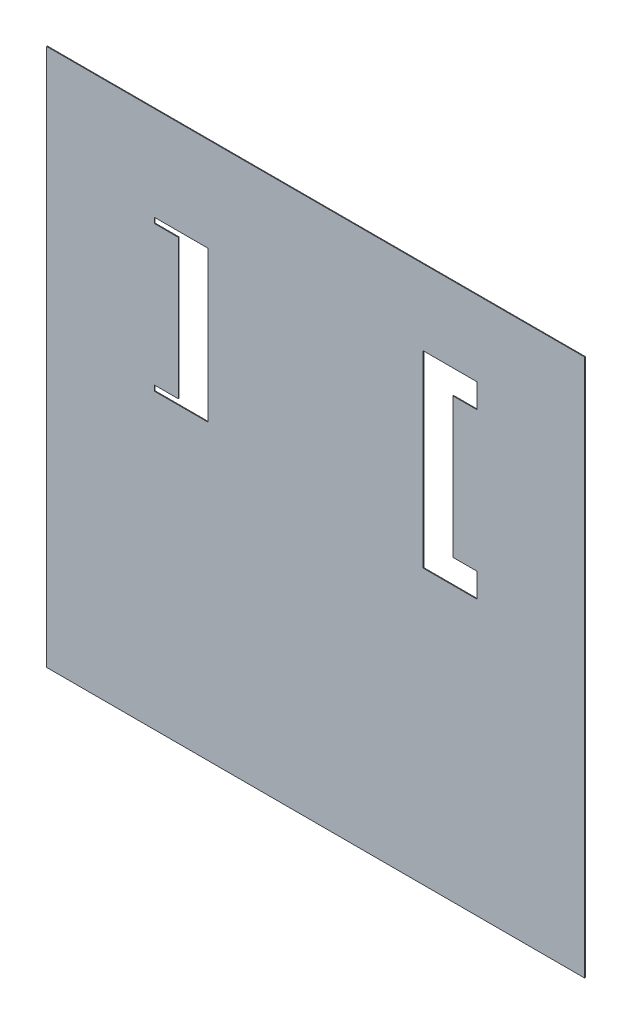
ISO-10303-21;
HEADER;
FILE_DESCRIPTION(('STEP AP214'),'2;1');
FILE_NAME('part.step','',(''),(''),'','','');
FILE_SCHEMA(('AUTOMOTIVE_DESIGN { 1 0 10303 214 1 1 1 1 }'));
ENDSEC;
DATA;
#1=APPLICATION_CONTEXT('core data for automotive mechanical design processes');
#2=APPLICATION_PROTOCOL_DEFINITION('international standard','automotive_design',2000,#1);
#3=PRODUCT_CONTEXT('',#1,'mechanical');
#4=PRODUCT('Part','Part','',(#3));
#5=PRODUCT_RELATED_PRODUCT_CATEGORY('part','',(#4));
#6=PRODUCT_DEFINITION_FORMATION('','',#4);
#7=PRODUCT_DEFINITION_CONTEXT('part definition',#1,'design');
#8=PRODUCT_DEFINITION('design','',#6,#7);
#9=PRODUCT_DEFINITION_SHAPE('','',#8);
#10=(LENGTH_UNIT() NAMED_UNIT(*) SI_UNIT(.MILLI.,.METRE.));
#11=(NAMED_UNIT(*) PLANE_ANGLE_UNIT() SI_UNIT($,.RADIAN.));
#12=(NAMED_UNIT(*) SI_UNIT($,.STERADIAN.) SOLID_ANGLE_UNIT());
#13=UNCERTAINTY_MEASURE_WITH_UNIT(LENGTH_MEASURE(1.E-05),#10,'distance_accuracy_value','');
#14=(GEOMETRIC_REPRESENTATION_CONTEXT(3) GLOBAL_UNCERTAINTY_ASSIGNED_CONTEXT((#13)) GLOBAL_UNIT_ASSIGNED_CONTEXT((#10,
#11,#12)) REPRESENTATION_CONTEXT('',''));
#15=CARTESIAN_POINT('',(0.,0.,0.));
#16=DIRECTION('',(0.,0.,1.));
#17=DIRECTION('',(1.,0.,0.));
#18=AXIS2_PLACEMENT_3D('',#15,#16,#17);
#19=CARTESIAN_POINT('',(0.,0.,0.03556));
#20=DIRECTION('',(1.,0.,0.));
#21=DIRECTION('',(0.,0.,-1.));
#22=AXIS2_PLACEMENT_3D('',#19,#20,#21);
#23=PLANE('',#22);
#24=DIRECTION('',(0.,-1.,0.));
#25=VECTOR('',#24,1.);
#26=CARTESIAN_POINT('',(0.,0.,0.));
#27=LINE('',#26,#25);
#28=CARTESIAN_POINT('',(0.,25.4,0.));
#29=VERTEX_POINT('',#28);
#30=CARTESIAN_POINT('',(0.,0.,0.));
#31=VERTEX_POINT('',#30);
#32=EDGE_CURVE('E287',#29,#31,#27,.T.);
#33=ORIENTED_EDGE('',*,*,#32,.T.);
#34=DIRECTION('',(0.,0.,-1.));
#35=VECTOR('',#34,1.);
#36=CARTESIAN_POINT('',(0.,0.,0.03556));
#37=LINE('',#36,#35);
#38=CARTESIAN_POINT('',(0.,0.,0.03556));
#39=VERTEX_POINT('',#38);
#40=EDGE_CURVE('E11',#39,#31,#37,.T.);
#41=ORIENTED_EDGE('',*,*,#40,.F.);
#42=DIRECTION('',(0.,-1.,0.));
#43=VECTOR('',#42,1.);
#44=CARTESIAN_POINT('',(0.,0.,0.03556));
#45=LINE('',#44,#43);
#46=CARTESIAN_POINT('',(0.,25.4,0.03556));
#47=VERTEX_POINT('',#46);
#48=EDGE_CURVE('E302',#47,#39,#45,.T.);
#49=ORIENTED_EDGE('',*,*,#48,.F.);
#50=DIRECTION('',(0.,0.,-1.));
#51=VECTOR('',#50,1.);
#52=CARTESIAN_POINT('',(0.,25.4,0.03556));
#53=LINE('',#52,#51);
#54=EDGE_CURVE('E312',#47,#29,#53,.T.);
#55=ORIENTED_EDGE('',*,*,#54,.T.);
#56=EDGE_LOOP('',(#33,#41,#49,#55));
#57=FACE_BOUND('',#56,.T.);
#58=ADVANCED_FACE('F33',(#57),#23,.F.);
#59=CARTESIAN_POINT('',(0.,0.,0.03556));
#60=DIRECTION('',(0.,1.,0.));
#61=DIRECTION('',(0.,0.,1.));
#62=AXIS2_PLACEMENT_3D('',#59,#60,#61);
#63=PLANE('',#62);
#64=DIRECTION('',(1.,0.,0.));
#65=VECTOR('',#64,1.);
#66=CARTESIAN_POINT('',(0.,0.,0.));
#67=LINE('',#66,#65);
#68=CARTESIAN_POINT('',(25.4,0.,0.));
#69=VERTEX_POINT('',#68);
#70=EDGE_CURVE('E315',#31,#69,#67,.T.);
#71=ORIENTED_EDGE('',*,*,#70,.T.);
#72=DIRECTION('',(0.,0.,-1.));
#73=VECTOR('',#72,1.);
#74=CARTESIAN_POINT('',(25.4,0.,0.03556));
#75=LINE('',#74,#73);
#76=CARTESIAN_POINT('',(25.4,0.,0.03556));
#77=VERTEX_POINT('',#76);
#78=EDGE_CURVE('E40',#77,#69,#75,.T.);
#79=ORIENTED_EDGE('',*,*,#78,.F.);
#80=DIRECTION('',(1.,0.,0.));
#81=VECTOR('',#80,1.);
#82=CARTESIAN_POINT('',(0.,0.,0.03556));
#83=LINE('',#82,#81);
#84=EDGE_CURVE('E305',#39,#77,#83,.T.);
#85=ORIENTED_EDGE('',*,*,#84,.F.);
#86=ORIENTED_EDGE('',*,*,#40,.T.);
#87=EDGE_LOOP('',(#71,#79,#85,#86));
#88=FACE_BOUND('',#87,.T.);
#89=ADVANCED_FACE('F344',(#88),#63,.F.);
#90=CARTESIAN_POINT('',(25.4,0.,0.03556));
#91=DIRECTION('',(-1.,0.,0.));
#92=DIRECTION('',(0.,0.,1.));
#93=AXIS2_PLACEMENT_3D('',#90,#91,#92);
#94=PLANE('',#93);
#95=DIRECTION('',(0.,1.,0.));
#96=VECTOR('',#95,1.);
#97=CARTESIAN_POINT('',(25.4,0.,0.));
#98=LINE('',#97,#96);
#99=CARTESIAN_POINT('',(25.4,25.4,0.));
#100=VERTEX_POINT('',#99);
#101=EDGE_CURVE('E317',#69,#100,#98,.T.);
#102=ORIENTED_EDGE('',*,*,#101,.T.);
#103=DIRECTION('',(0.,0.,-1.));
#104=VECTOR('',#103,1.);
#105=CARTESIAN_POINT('',(25.4,25.4,0.03556));
#106=LINE('',#105,#104);
#107=CARTESIAN_POINT('',(25.4,25.4,0.03556));
#108=VERTEX_POINT('',#107);
#109=EDGE_CURVE('E322',#108,#100,#106,.T.);
#110=ORIENTED_EDGE('',*,*,#109,.F.);
#111=DIRECTION('',(0.,1.,0.));
#112=VECTOR('',#111,1.);
#113=CARTESIAN_POINT('',(25.4,0.,0.03556));
#114=LINE('',#113,#112);
#115=EDGE_CURVE('E308',#77,#108,#114,.T.);
#116=ORIENTED_EDGE('',*,*,#115,.F.);
#117=ORIENTED_EDGE('',*,*,#78,.T.);
#118=EDGE_LOOP('',(#102,#110,#116,#117));
#119=FACE_BOUND('',#118,.T.);
#120=ADVANCED_FACE('F329',(#119),#94,.F.);
#121=CARTESIAN_POINT('',(0.,25.4,0.03556));
#122=DIRECTION('',(0.,-1.,0.));
#123=DIRECTION('',(0.,0.,-1.));
#124=AXIS2_PLACEMENT_3D('',#121,#122,#123);
#125=PLANE('',#124);
#126=DIRECTION('',(-1.,0.,0.));
#127=VECTOR('',#126,1.);
#128=CARTESIAN_POINT('',(0.,25.4,0.));
#129=LINE('',#128,#127);
#130=EDGE_CURVE('E306',#100,#29,#129,.T.);
#131=ORIENTED_EDGE('',*,*,#130,.T.);
#132=ORIENTED_EDGE('',*,*,#54,.F.);
#133=DIRECTION('',(-1.,0.,0.));
#134=VECTOR('',#133,1.);
#135=CARTESIAN_POINT('',(0.,25.4,0.03556));
#136=LINE('',#135,#134);
#137=EDGE_CURVE('E310',#108,#47,#136,.T.);
#138=ORIENTED_EDGE('',*,*,#137,.F.);
#139=ORIENTED_EDGE('',*,*,#109,.T.);
#140=EDGE_LOOP('',(#131,#132,#138,#139));
#141=FACE_BOUND('',#140,.T.);
#142=ADVANCED_FACE('F337',(#141),#125,.F.);
#143=CARTESIAN_POINT('',(0.,0.,0.03556));
#144=DIRECTION('',(0.,0.,-1.));
#145=DIRECTION('',(-1.,0.,0.));
#146=AXIS2_PLACEMENT_3D('',#143,#144,#145);
#147=PLANE('',#146);
#148=DIRECTION('',(1.,0.,0.));
#149=VECTOR('',#148,1.);
#150=CARTESIAN_POINT('',(17.78,12.954,0.03556));
#151=LINE('',#150,#149);
#152=CARTESIAN_POINT('',(17.78,12.954,0.03556));
#153=VERTEX_POINT('',#152);
#154=CARTESIAN_POINT('',(20.32,12.954,0.03556));
#155=VERTEX_POINT('',#154);
#156=EDGE_CURVE('E208',#153,#155,#151,.T.);
#157=ORIENTED_EDGE('',*,*,#156,.F.);
#158=DIRECTION('',(0.,-1.,0.));
#159=VECTOR('',#158,1.);
#160=CARTESIAN_POINT('',(17.78,21.844,0.03556));
#161=LINE('',#160,#159);
#162=CARTESIAN_POINT('',(17.78,21.844,0.03556));
#163=VERTEX_POINT('',#162);
#164=EDGE_CURVE('E47',#163,#153,#161,.T.);
#165=ORIENTED_EDGE('',*,*,#164,.F.);
#166=DIRECTION('',(-1.,0.,0.));
#167=VECTOR('',#166,1.);
#168=CARTESIAN_POINT('',(17.78,21.844,0.03556));
#169=LINE('',#168,#167);
#170=CARTESIAN_POINT('',(20.32,21.844,0.03556));
#171=VERTEX_POINT('',#170);
#172=EDGE_CURVE('E188',#171,#163,#169,.T.);
#173=ORIENTED_EDGE('',*,*,#172,.F.);
#174=DIRECTION('',(0.,1.,0.));
#175=VECTOR('',#174,1.);
#176=CARTESIAN_POINT('',(20.32,21.844,0.03556));
#177=LINE('',#176,#175);
#178=CARTESIAN_POINT('',(20.32,20.701,0.03556));
#179=VERTEX_POINT('',#178);
#180=EDGE_CURVE('E191',#179,#171,#177,.T.);
#181=ORIENTED_EDGE('',*,*,#180,.F.);
#182=DIRECTION('',(1.,0.,0.));
#183=VECTOR('',#182,1.);
#184=CARTESIAN_POINT('',(20.32,20.701,0.03556));
#185=LINE('',#184,#183);
#186=CARTESIAN_POINT('',(19.177,20.701,0.03556));
#187=VERTEX_POINT('',#186);
#188=EDGE_CURVE('E219',#187,#179,#185,.T.);
#189=ORIENTED_EDGE('',*,*,#188,.F.);
#190=DIRECTION('',(0.,1.,0.));
#191=VECTOR('',#190,1.);
#192=CARTESIAN_POINT('',(19.177,14.097,0.03556));
#193=LINE('',#192,#191);
#194=CARTESIAN_POINT('',(19.177,14.097,0.03556));
#195=VERTEX_POINT('',#194);
#196=EDGE_CURVE('E216',#195,#187,#193,.T.);
#197=ORIENTED_EDGE('',*,*,#196,.F.);
#198=DIRECTION('',(-1.,0.,0.));
#199=VECTOR('',#198,1.);
#200=CARTESIAN_POINT('',(20.32,14.097,0.03556));
#201=LINE('',#200,#199);
#202=CARTESIAN_POINT('',(20.32,14.097,0.03556));
#203=VERTEX_POINT('',#202);
#204=EDGE_CURVE('E213',#203,#195,#201,.T.);
#205=ORIENTED_EDGE('',*,*,#204,.F.);
#206=DIRECTION('',(0.,1.,0.));
#207=VECTOR('',#206,1.);
#208=CARTESIAN_POINT('',(20.32,14.097,0.03556));
#209=LINE('',#208,#207);
#210=EDGE_CURVE('E210',#155,#203,#209,.T.);
#211=ORIENTED_EDGE('',*,*,#210,.F.);
#212=EDGE_LOOP('',(#157,#165,#173,#181,#189,#197,#205,#211));
#213=FACE_BOUND('',#212,.T.);
#214=DIRECTION('',(1.,0.,0.));
#215=VECTOR('',#214,1.);
#216=CARTESIAN_POINT('',(5.08,20.701,0.03556));
#217=LINE('',#216,#215);
#218=CARTESIAN_POINT('',(5.08,20.701,0.03556));
#219=VERTEX_POINT('',#218);
#220=CARTESIAN_POINT('',(6.223,20.701,0.03556));
#221=VERTEX_POINT('',#220);
#222=EDGE_CURVE('E265',#219,#221,#217,.T.);
#223=ORIENTED_EDGE('',*,*,#222,.F.);
#224=DIRECTION('',(0.,-1.,0.));
#225=VECTOR('',#224,1.);
#226=CARTESIAN_POINT('',(5.08,20.955,0.03556));
#227=LINE('',#226,#225);
#228=CARTESIAN_POINT('',(5.08,20.955,0.03556));
#229=VERTEX_POINT('',#228);
#230=EDGE_CURVE('E226',#229,#219,#227,.T.);
#231=ORIENTED_EDGE('',*,*,#230,.F.);
#232=DIRECTION('',(-1.,0.,0.));
#233=VECTOR('',#232,1.);
#234=CARTESIAN_POINT('',(5.08,20.955,0.03556));
#235=LINE('',#234,#233);
#236=CARTESIAN_POINT('',(7.62,20.955,0.03556));
#237=VERTEX_POINT('',#236);
#238=EDGE_CURVE('E242',#237,#229,#235,.T.);
#239=ORIENTED_EDGE('',*,*,#238,.F.);
#240=DIRECTION('',(0.,1.,0.));
#241=VECTOR('',#240,1.);
#242=CARTESIAN_POINT('',(7.62,20.955,0.03556));
#243=LINE('',#242,#241);
#244=CARTESIAN_POINT('',(7.62,13.843,0.03556));
#245=VERTEX_POINT('',#244);
#246=EDGE_CURVE('E280',#245,#237,#243,.T.);
#247=ORIENTED_EDGE('',*,*,#246,.F.);
#248=DIRECTION('',(1.,0.,0.));
#249=VECTOR('',#248,1.);
#250=CARTESIAN_POINT('',(5.08,13.843,0.03556));
#251=LINE('',#250,#249);
#252=CARTESIAN_POINT('',(5.08,13.843,0.03556));
#253=VERTEX_POINT('',#252);
#254=EDGE_CURVE('E277',#253,#245,#251,.T.);
#255=ORIENTED_EDGE('',*,*,#254,.F.);
#256=DIRECTION('',(0.,-1.,0.));
#257=VECTOR('',#256,1.);
#258=CARTESIAN_POINT('',(5.08,14.097,0.03556));
#259=LINE('',#258,#257);
#260=CARTESIAN_POINT('',(5.08,14.097,0.03556));
#261=VERTEX_POINT('',#260);
#262=EDGE_CURVE('E274',#261,#253,#259,.T.);
#263=ORIENTED_EDGE('',*,*,#262,.F.);
#264=DIRECTION('',(-1.,0.,0.));
#265=VECTOR('',#264,1.);
#266=CARTESIAN_POINT('',(5.08,14.097,0.03556));
#267=LINE('',#266,#265);
#268=CARTESIAN_POINT('',(6.223,14.097,0.03556));
#269=VERTEX_POINT('',#268);
#270=EDGE_CURVE('E271',#269,#261,#267,.T.);
#271=ORIENTED_EDGE('',*,*,#270,.F.);
#272=DIRECTION('',(0.,-1.,0.));
#273=VECTOR('',#272,1.);
#274=CARTESIAN_POINT('',(6.223,14.097,0.03556));
#275=LINE('',#274,#273);
#276=EDGE_CURVE('E268',#221,#269,#275,.T.);
#277=ORIENTED_EDGE('',*,*,#276,.F.);
#278=EDGE_LOOP('',(#223,#231,#239,#247,#255,#263,#271,#277));
#279=FACE_BOUND('',#278,.T.);
#280=ORIENTED_EDGE('',*,*,#48,.T.);
#281=ORIENTED_EDGE('',*,*,#84,.T.);
#282=ORIENTED_EDGE('',*,*,#115,.T.);
#283=ORIENTED_EDGE('',*,*,#137,.T.);
#284=EDGE_LOOP('',(#280,#281,#282,#283));
#285=FACE_BOUND('',#284,.T.);
#286=ADVANCED_FACE('F343',(#213,#279,#285),#147,.F.);
#287=CARTESIAN_POINT('',(0.,0.,0.));
#288=DIRECTION('',(0.,0.,-1.));
#289=DIRECTION('',(-1.,0.,0.));
#290=AXIS2_PLACEMENT_3D('',#287,#288,#289);
#291=PLANE('',#290);
#292=DIRECTION('',(0.,-1.,0.));
#293=VECTOR('',#292,1.);
#294=CARTESIAN_POINT('',(17.78,21.844,0.));
#295=LINE('',#294,#293);
#296=CARTESIAN_POINT('',(17.78,21.844,0.));
#297=VERTEX_POINT('',#296);
#298=CARTESIAN_POINT('',(17.78,12.954,0.));
#299=VERTEX_POINT('',#298);
#300=EDGE_CURVE('E171',#297,#299,#295,.T.);
#301=ORIENTED_EDGE('',*,*,#300,.T.);
#302=DIRECTION('',(1.,0.,0.));
#303=VECTOR('',#302,1.);
#304=CARTESIAN_POINT('',(17.78,12.954,0.));
#305=LINE('',#304,#303);
#306=CARTESIAN_POINT('',(20.32,12.954,0.));
#307=VERTEX_POINT('',#306);
#308=EDGE_CURVE('E180',#299,#307,#305,.T.);
#309=ORIENTED_EDGE('',*,*,#308,.T.);
#310=DIRECTION('',(0.,1.,0.));
#311=VECTOR('',#310,1.);
#312=CARTESIAN_POINT('',(20.32,14.097,0.));
#313=LINE('',#312,#311);
#314=CARTESIAN_POINT('',(20.32,14.097,0.));
#315=VERTEX_POINT('',#314);
#316=EDGE_CURVE('E55',#307,#315,#313,.T.);
#317=ORIENTED_EDGE('',*,*,#316,.T.);
#318=DIRECTION('',(-1.,0.,0.));
#319=VECTOR('',#318,1.);
#320=CARTESIAN_POINT('',(20.32,14.097,0.));
#321=LINE('',#320,#319);
#322=CARTESIAN_POINT('',(19.177,14.097,0.));
#323=VERTEX_POINT('',#322);
#324=EDGE_CURVE('E195',#315,#323,#321,.T.);
#325=ORIENTED_EDGE('',*,*,#324,.T.);
#326=DIRECTION('',(0.,1.,0.));
#327=VECTOR('',#326,1.);
#328=CARTESIAN_POINT('',(19.177,14.097,0.));
#329=LINE('',#328,#327);
#330=CARTESIAN_POINT('',(19.177,20.701,0.));
#331=VERTEX_POINT('',#330);
#332=EDGE_CURVE('E198',#323,#331,#329,.T.);
#333=ORIENTED_EDGE('',*,*,#332,.T.);
#334=DIRECTION('',(1.,0.,0.));
#335=VECTOR('',#334,1.);
#336=CARTESIAN_POINT('',(20.32,20.701,0.));
#337=LINE('',#336,#335);
#338=CARTESIAN_POINT('',(20.32,20.701,0.));
#339=VERTEX_POINT('',#338);
#340=EDGE_CURVE('E201',#331,#339,#337,.T.);
#341=ORIENTED_EDGE('',*,*,#340,.T.);
#342=DIRECTION('',(0.,1.,0.));
#343=VECTOR('',#342,1.);
#344=CARTESIAN_POINT('',(20.32,21.844,0.));
#345=LINE('',#344,#343);
#346=CARTESIAN_POINT('',(20.32,21.844,0.));
#347=VERTEX_POINT('',#346);
#348=EDGE_CURVE('E204',#339,#347,#345,.T.);
#349=ORIENTED_EDGE('',*,*,#348,.T.);
#350=DIRECTION('',(-1.,0.,0.));
#351=VECTOR('',#350,1.);
#352=CARTESIAN_POINT('',(17.78,21.844,0.));
#353=LINE('',#352,#351);
#354=EDGE_CURVE('E177',#347,#297,#353,.T.);
#355=ORIENTED_EDGE('',*,*,#354,.T.);
#356=EDGE_LOOP('',(#301,#309,#317,#325,#333,#341,#349,#355));
#357=FACE_BOUND('',#356,.T.);
#358=DIRECTION('',(0.,-1.,0.));
#359=VECTOR('',#358,1.);
#360=CARTESIAN_POINT('',(5.08,20.955,0.));
#361=LINE('',#360,#359);
#362=CARTESIAN_POINT('',(5.08,20.955,0.));
#363=VERTEX_POINT('',#362);
#364=CARTESIAN_POINT('',(5.08,20.701,0.));
#365=VERTEX_POINT('',#364);
#366=EDGE_CURVE('E238',#363,#365,#361,.T.);
#367=ORIENTED_EDGE('',*,*,#366,.T.);
#368=DIRECTION('',(1.,0.,0.));
#369=VECTOR('',#368,1.);
#370=CARTESIAN_POINT('',(5.08,20.701,0.));
#371=LINE('',#370,#369);
#372=CARTESIAN_POINT('',(6.223,20.701,0.));
#373=VERTEX_POINT('',#372);
#374=EDGE_CURVE('E241',#365,#373,#371,.T.);
#375=ORIENTED_EDGE('',*,*,#374,.T.);
#376=DIRECTION('',(0.,-1.,0.));
#377=VECTOR('',#376,1.);
#378=CARTESIAN_POINT('',(6.223,14.097,0.));
#379=LINE('',#378,#377);
#380=CARTESIAN_POINT('',(6.223,14.097,0.));
#381=VERTEX_POINT('',#380);
#382=EDGE_CURVE('E245',#373,#381,#379,.T.);
#383=ORIENTED_EDGE('',*,*,#382,.T.);
#384=DIRECTION('',(-1.,0.,0.));
#385=VECTOR('',#384,1.);
#386=CARTESIAN_POINT('',(5.08,14.097,0.));
#387=LINE('',#386,#385);
#388=CARTESIAN_POINT('',(5.08,14.097,0.));
#389=VERTEX_POINT('',#388);
#390=EDGE_CURVE('E248',#381,#389,#387,.T.);
#391=ORIENTED_EDGE('',*,*,#390,.T.);
#392=DIRECTION('',(0.,-1.,0.));
#393=VECTOR('',#392,1.);
#394=CARTESIAN_POINT('',(5.08,14.097,0.));
#395=LINE('',#394,#393);
#396=CARTESIAN_POINT('',(5.08,13.843,0.));
#397=VERTEX_POINT('',#396);
#398=EDGE_CURVE('E251',#389,#397,#395,.T.);
#399=ORIENTED_EDGE('',*,*,#398,.T.);
#400=DIRECTION('',(1.,0.,0.));
#401=VECTOR('',#400,1.);
#402=CARTESIAN_POINT('',(5.08,13.843,0.));
#403=LINE('',#402,#401);
#404=CARTESIAN_POINT('',(7.62,13.843,0.));
#405=VERTEX_POINT('',#404);
#406=EDGE_CURVE('E254',#397,#405,#403,.T.);
#407=ORIENTED_EDGE('',*,*,#406,.T.);
#408=DIRECTION('',(0.,1.,0.));
#409=VECTOR('',#408,1.);
#410=CARTESIAN_POINT('',(7.62,20.955,0.));
#411=LINE('',#410,#409);
#412=CARTESIAN_POINT('',(7.62,20.955,0.));
#413=VERTEX_POINT('',#412);
#414=EDGE_CURVE('E257',#405,#413,#411,.T.);
#415=ORIENTED_EDGE('',*,*,#414,.T.);
#416=DIRECTION('',(-1.,0.,0.));
#417=VECTOR('',#416,1.);
#418=CARTESIAN_POINT('',(5.08,20.955,0.));
#419=LINE('',#418,#417);
#420=EDGE_CURVE('E260',#413,#363,#419,.T.);
#421=ORIENTED_EDGE('',*,*,#420,.T.);
#422=EDGE_LOOP('',(#367,#375,#383,#391,#399,#407,#415,#421));
#423=FACE_BOUND('',#422,.T.);
#424=ORIENTED_EDGE('',*,*,#32,.F.);
#425=ORIENTED_EDGE('',*,*,#130,.F.);
#426=ORIENTED_EDGE('',*,*,#101,.F.);
#427=ORIENTED_EDGE('',*,*,#70,.F.);
#428=EDGE_LOOP('',(#424,#425,#426,#427));
#429=FACE_BOUND('',#428,.T.);
#430=ADVANCED_FACE('F184',(#357,#423,#429),#291,.T.);
#431=CARTESIAN_POINT('',(5.08,20.955,0.));
#432=DIRECTION('',(-1.,0.,0.));
#433=DIRECTION('',(0.,-1.,0.));
#434=AXIS2_PLACEMENT_3D('',#431,#432,#433);
#435=PLANE('',#434);
#436=ORIENTED_EDGE('',*,*,#230,.T.);
#437=DIRECTION('',(0.,0.,1.));
#438=VECTOR('',#437,1.);
#439=CARTESIAN_POINT('',(5.08,20.701,0.));
#440=LINE('',#439,#438);
#441=EDGE_CURVE('E263',#365,#219,#440,.T.);
#442=ORIENTED_EDGE('',*,*,#441,.F.);
#443=ORIENTED_EDGE('',*,*,#366,.F.);
#444=DIRECTION('',(0.,0.,1.));
#445=VECTOR('',#444,1.);
#446=CARTESIAN_POINT('',(5.08,20.955,0.));
#447=LINE('',#446,#445);
#448=EDGE_CURVE('E285',#363,#229,#447,.T.);
#449=ORIENTED_EDGE('',*,*,#448,.T.);
#450=EDGE_LOOP('',(#436,#442,#443,#449));
#451=FACE_BOUND('',#450,.T.);
#452=ADVANCED_FACE('F356',(#451),#435,.F.);
#453=CARTESIAN_POINT('',(5.08,20.955,0.));
#454=DIRECTION('',(0.,1.,0.));
#455=DIRECTION('',(0.,0.,1.));
#456=AXIS2_PLACEMENT_3D('',#453,#454,#455);
#457=PLANE('',#456);
#458=ORIENTED_EDGE('',*,*,#238,.T.);
#459=ORIENTED_EDGE('',*,*,#448,.F.);
#460=ORIENTED_EDGE('',*,*,#420,.F.);
#461=DIRECTION('',(0.,0.,1.));
#462=VECTOR('',#461,1.);
#463=CARTESIAN_POINT('',(7.62,20.955,0.));
#464=LINE('',#463,#462);
#465=EDGE_CURVE('E288',#413,#237,#464,.T.);
#466=ORIENTED_EDGE('',*,*,#465,.T.);
#467=EDGE_LOOP('',(#458,#459,#460,#466));
#468=FACE_BOUND('',#467,.T.);
#469=ADVANCED_FACE('F362',(#468),#457,.F.);
#470=CARTESIAN_POINT('',(7.62,20.955,0.));
#471=DIRECTION('',(1.,0.,0.));
#472=DIRECTION('',(0.,1.,0.));
#473=AXIS2_PLACEMENT_3D('',#470,#471,#472);
#474=PLANE('',#473);
#475=ORIENTED_EDGE('',*,*,#246,.T.);
#476=ORIENTED_EDGE('',*,*,#465,.F.);
#477=ORIENTED_EDGE('',*,*,#414,.F.);
#478=DIRECTION('',(0.,0.,1.));
#479=VECTOR('',#478,1.);
#480=CARTESIAN_POINT('',(7.62,13.843,0.));
#481=LINE('',#480,#479);
#482=EDGE_CURVE('E290',#405,#245,#481,.T.);
#483=ORIENTED_EDGE('',*,*,#482,.T.);
#484=EDGE_LOOP('',(#475,#476,#477,#483));
#485=FACE_BOUND('',#484,.T.);
#486=ADVANCED_FACE('F383',(#485),#474,.F.);
#487=CARTESIAN_POINT('',(5.08,13.843,0.));
#488=DIRECTION('',(0.,-1.,0.));
#489=DIRECTION('',(0.,0.,-1.));
#490=AXIS2_PLACEMENT_3D('',#487,#488,#489);
#491=PLANE('',#490);
#492=ORIENTED_EDGE('',*,*,#254,.T.);
#493=ORIENTED_EDGE('',*,*,#482,.F.);
#494=ORIENTED_EDGE('',*,*,#406,.F.);
#495=DIRECTION('',(0.,0.,1.));
#496=VECTOR('',#495,1.);
#497=CARTESIAN_POINT('',(5.08,13.843,0.));
#498=LINE('',#497,#496);
#499=EDGE_CURVE('E292',#397,#253,#498,.T.);
#500=ORIENTED_EDGE('',*,*,#499,.T.);
#501=EDGE_LOOP('',(#492,#493,#494,#500));
#502=FACE_BOUND('',#501,.T.);
#503=ADVANCED_FACE('F379',(#502),#491,.F.);
#504=CARTESIAN_POINT('',(5.08,14.097,0.));
#505=DIRECTION('',(-1.,0.,0.));
#506=DIRECTION('',(0.,0.,1.));
#507=AXIS2_PLACEMENT_3D('',#504,#505,#506);
#508=PLANE('',#507);
#509=ORIENTED_EDGE('',*,*,#262,.T.);
#510=ORIENTED_EDGE('',*,*,#499,.F.);
#511=ORIENTED_EDGE('',*,*,#398,.F.);
#512=DIRECTION('',(0.,0.,1.));
#513=VECTOR('',#512,1.);
#514=CARTESIAN_POINT('',(5.08,14.097,0.));
#515=LINE('',#514,#513);
#516=EDGE_CURVE('E294',#389,#261,#515,.T.);
#517=ORIENTED_EDGE('',*,*,#516,.T.);
#518=EDGE_LOOP('',(#509,#510,#511,#517));
#519=FACE_BOUND('',#518,.T.);
#520=ADVANCED_FACE('F375',(#519),#508,.F.);
#521=CARTESIAN_POINT('',(5.08,14.097,0.));
#522=DIRECTION('',(0.,1.,0.));
#523=DIRECTION('',(0.,0.,1.));
#524=AXIS2_PLACEMENT_3D('',#521,#522,#523);
#525=PLANE('',#524);
#526=ORIENTED_EDGE('',*,*,#270,.T.);
#527=ORIENTED_EDGE('',*,*,#516,.F.);
#528=ORIENTED_EDGE('',*,*,#390,.F.);
#529=DIRECTION('',(0.,0.,1.));
#530=VECTOR('',#529,1.);
#531=CARTESIAN_POINT('',(6.223,14.097,0.));
#532=LINE('',#531,#530);
#533=EDGE_CURVE('E296',#381,#269,#532,.T.);
#534=ORIENTED_EDGE('',*,*,#533,.T.);
#535=EDGE_LOOP('',(#526,#527,#528,#534));
#536=FACE_BOUND('',#535,.T.);
#537=ADVANCED_FACE('F371',(#536),#525,.F.);
#538=CARTESIAN_POINT('',(6.223,14.097,0.));
#539=DIRECTION('',(-1.,0.,0.));
#540=DIRECTION('',(0.,0.,1.));
#541=AXIS2_PLACEMENT_3D('',#538,#539,#540);
#542=PLANE('',#541);
#543=ORIENTED_EDGE('',*,*,#276,.T.);
#544=ORIENTED_EDGE('',*,*,#533,.F.);
#545=ORIENTED_EDGE('',*,*,#382,.F.);
#546=DIRECTION('',(0.,0.,1.));
#547=VECTOR('',#546,1.);
#548=CARTESIAN_POINT('',(6.223,20.701,0.));
#549=LINE('',#548,#547);
#550=EDGE_CURVE('E298',#373,#221,#549,.T.);
#551=ORIENTED_EDGE('',*,*,#550,.T.);
#552=EDGE_LOOP('',(#543,#544,#545,#551));
#553=FACE_BOUND('',#552,.T.);
#554=ADVANCED_FACE('F367',(#553),#542,.F.);
#555=CARTESIAN_POINT('',(5.08,20.701,0.));
#556=DIRECTION('',(0.,-1.,0.));
#557=DIRECTION('',(0.,0.,-1.));
#558=AXIS2_PLACEMENT_3D('',#555,#556,#557);
#559=PLANE('',#558);
#560=ORIENTED_EDGE('',*,*,#222,.T.);
#561=ORIENTED_EDGE('',*,*,#550,.F.);
#562=ORIENTED_EDGE('',*,*,#374,.F.);
#563=ORIENTED_EDGE('',*,*,#441,.T.);
#564=EDGE_LOOP('',(#560,#561,#562,#563));
#565=FACE_BOUND('',#564,.T.);
#566=ADVANCED_FACE('F364',(#565),#559,.F.);
#567=CARTESIAN_POINT('',(17.78,21.844,0.));
#568=DIRECTION('',(-1.,0.,0.));
#569=DIRECTION('',(0.,-1.,0.));
#570=AXIS2_PLACEMENT_3D('',#567,#568,#569);
#571=PLANE('',#570);
#572=ORIENTED_EDGE('',*,*,#164,.T.);
#573=DIRECTION('',(0.,0.,1.));
#574=VECTOR('',#573,1.);
#575=CARTESIAN_POINT('',(17.78,12.954,0.));
#576=LINE('',#575,#574);
#577=EDGE_CURVE('E167',#299,#153,#576,.T.);
#578=ORIENTED_EDGE('',*,*,#577,.F.);
#579=ORIENTED_EDGE('',*,*,#300,.F.);
#580=DIRECTION('',(0.,0.,1.));
#581=VECTOR('',#580,1.);
#582=CARTESIAN_POINT('',(17.78,21.844,0.));
#583=LINE('',#582,#581);
#584=EDGE_CURVE('E224',#297,#163,#583,.T.);
#585=ORIENTED_EDGE('',*,*,#584,.T.);
#586=EDGE_LOOP('',(#572,#578,#579,#585));
#587=FACE_BOUND('',#586,.T.);
#588=ADVANCED_FACE('F169',(#587),#571,.F.);
#589=CARTESIAN_POINT('',(17.78,21.844,0.));
#590=DIRECTION('',(0.,1.,0.));
#591=DIRECTION('',(-1.,0.,0.));
#592=AXIS2_PLACEMENT_3D('',#589,#590,#591);
#593=PLANE('',#592);
#594=ORIENTED_EDGE('',*,*,#172,.T.);
#595=ORIENTED_EDGE('',*,*,#584,.F.);
#596=ORIENTED_EDGE('',*,*,#354,.F.);
#597=DIRECTION('',(0.,0.,1.));
#598=VECTOR('',#597,1.);
#599=CARTESIAN_POINT('',(20.32,21.844,0.));
#600=LINE('',#599,#598);
#601=EDGE_CURVE('E227',#347,#171,#600,.T.);
#602=ORIENTED_EDGE('',*,*,#601,.T.);
#603=EDGE_LOOP('',(#594,#595,#596,#602));
#604=FACE_BOUND('',#603,.T.);
#605=ADVANCED_FACE('F393',(#604),#593,.F.);
#606=CARTESIAN_POINT('',(20.32,21.844,0.));
#607=DIRECTION('',(1.,0.,0.));
#608=DIRECTION('',(0.,1.,0.));
#609=AXIS2_PLACEMENT_3D('',#606,#607,#608);
#610=PLANE('',#609);
#611=ORIENTED_EDGE('',*,*,#180,.T.);
#612=ORIENTED_EDGE('',*,*,#601,.F.);
#613=ORIENTED_EDGE('',*,*,#348,.F.);
#614=DIRECTION('',(0.,0.,1.));
#615=VECTOR('',#614,1.);
#616=CARTESIAN_POINT('',(20.32,20.701,0.));
#617=LINE('',#616,#615);
#618=EDGE_CURVE('E229',#339,#179,#617,.T.);
#619=ORIENTED_EDGE('',*,*,#618,.T.);
#620=EDGE_LOOP('',(#611,#612,#613,#619));
#621=FACE_BOUND('',#620,.T.);
#622=ADVANCED_FACE('F410',(#621),#610,.F.);
#623=CARTESIAN_POINT('',(20.32,20.701,0.));
#624=DIRECTION('',(0.,-1.,0.));
#625=DIRECTION('',(1.,0.,0.));
#626=AXIS2_PLACEMENT_3D('',#623,#624,#625);
#627=PLANE('',#626);
#628=ORIENTED_EDGE('',*,*,#188,.T.);
#629=ORIENTED_EDGE('',*,*,#618,.F.);
#630=ORIENTED_EDGE('',*,*,#340,.F.);
#631=DIRECTION('',(0.,0.,1.));
#632=VECTOR('',#631,1.);
#633=CARTESIAN_POINT('',(19.177,20.701,0.));
#634=LINE('',#633,#632);
#635=EDGE_CURVE('E231',#331,#187,#634,.T.);
#636=ORIENTED_EDGE('',*,*,#635,.T.);
#637=EDGE_LOOP('',(#628,#629,#630,#636));
#638=FACE_BOUND('',#637,.T.);
#639=ADVANCED_FACE('F406',(#638),#627,.F.);
#640=CARTESIAN_POINT('',(19.177,14.097,0.));
#641=DIRECTION('',(1.,0.,0.));
#642=DIRECTION('',(0.,0.,-1.));
#643=AXIS2_PLACEMENT_3D('',#640,#641,#642);
#644=PLANE('',#643);
#645=ORIENTED_EDGE('',*,*,#196,.T.);
#646=ORIENTED_EDGE('',*,*,#635,.F.);
#647=ORIENTED_EDGE('',*,*,#332,.F.);
#648=DIRECTION('',(0.,0.,1.));
#649=VECTOR('',#648,1.);
#650=CARTESIAN_POINT('',(19.177,14.097,0.));
#651=LINE('',#650,#649);
#652=EDGE_CURVE('E233',#323,#195,#651,.T.);
#653=ORIENTED_EDGE('',*,*,#652,.T.);
#654=EDGE_LOOP('',(#645,#646,#647,#653));
#655=FACE_BOUND('',#654,.T.);
#656=ADVANCED_FACE('F402',(#655),#644,.F.);
#657=CARTESIAN_POINT('',(20.32,14.097,0.));
#658=DIRECTION('',(0.,1.,0.));
#659=DIRECTION('',(-1.,0.,0.));
#660=AXIS2_PLACEMENT_3D('',#657,#658,#659);
#661=PLANE('',#660);
#662=ORIENTED_EDGE('',*,*,#204,.T.);
#663=ORIENTED_EDGE('',*,*,#652,.F.);
#664=ORIENTED_EDGE('',*,*,#324,.F.);
#665=DIRECTION('',(0.,0.,1.));
#666=VECTOR('',#665,1.);
#667=CARTESIAN_POINT('',(20.32,14.097,0.));
#668=LINE('',#667,#666);
#669=EDGE_CURVE('E235',#315,#203,#668,.T.);
#670=ORIENTED_EDGE('',*,*,#669,.T.);
#671=EDGE_LOOP('',(#662,#663,#664,#670));
#672=FACE_BOUND('',#671,.T.);
#673=ADVANCED_FACE('F399',(#672),#661,.F.);
#674=CARTESIAN_POINT('',(20.32,14.097,0.));
#675=DIRECTION('',(1.,0.,0.));
#676=DIRECTION('',(0.,1.,0.));
#677=AXIS2_PLACEMENT_3D('',#674,#675,#676);
#678=PLANE('',#677);
#679=ORIENTED_EDGE('',*,*,#210,.T.);
#680=ORIENTED_EDGE('',*,*,#669,.F.);
#681=ORIENTED_EDGE('',*,*,#316,.F.);
#682=DIRECTION('',(0.,0.,1.));
#683=VECTOR('',#682,1.);
#684=CARTESIAN_POINT('',(20.32,12.954,0.));
#685=LINE('',#684,#683);
#686=EDGE_CURVE('E176',#307,#155,#685,.T.);
#687=ORIENTED_EDGE('',*,*,#686,.T.);
#688=EDGE_LOOP('',(#679,#680,#681,#687));
#689=FACE_BOUND('',#688,.T.);
#690=ADVANCED_FACE('F396',(#689),#678,.F.);
#691=CARTESIAN_POINT('',(17.78,12.954,0.));
#692=DIRECTION('',(0.,-1.,0.));
#693=DIRECTION('',(0.,0.,-1.));
#694=AXIS2_PLACEMENT_3D('',#691,#692,#693);
#695=PLANE('',#694);
#696=ORIENTED_EDGE('',*,*,#156,.T.);
#697=ORIENTED_EDGE('',*,*,#686,.F.);
#698=ORIENTED_EDGE('',*,*,#308,.F.);
#699=ORIENTED_EDGE('',*,*,#577,.T.);
#700=EDGE_LOOP('',(#696,#697,#698,#699));
#701=FACE_BOUND('',#700,.T.);
#702=ADVANCED_FACE('F181',(#701),#695,.F.);
#703=CLOSED_SHELL('',(#58,#89,#120,#142,#286,#430,#452,#469,#486,#503,#520,#537,#554,#566,#588,
#605,#622,#639,#656,#673,#690,#702));
#704=MANIFOLD_SOLID_BREP('B2',#703);
#705=ADVANCED_BREP_SHAPE_REPRESENTATION('',(#18,#704),#14);
#706=SHAPE_DEFINITION_REPRESENTATION(#9,#705);
ENDSEC;
END-ISO-10303-21;
